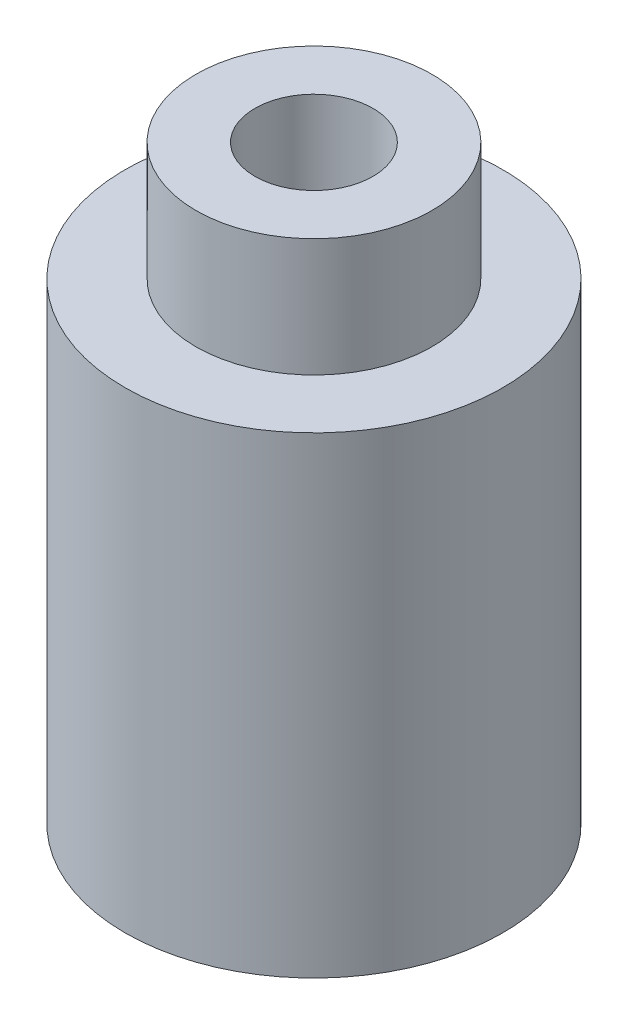
ISO-10303-21;
HEADER;
FILE_DESCRIPTION(('STEP AP214'),'2;1');
FILE_NAME('part.step','',(''),(''),'','','');
FILE_SCHEMA(('AUTOMOTIVE_DESIGN { 1 0 10303 214 1 1 1 1 }'));
ENDSEC;
DATA;
#1=APPLICATION_CONTEXT('core data for automotive mechanical design processes');
#2=APPLICATION_PROTOCOL_DEFINITION('international standard','automotive_design',2000,#1);
#3=PRODUCT_CONTEXT('',#1,'mechanical');
#4=PRODUCT('Part','Part','',(#3));
#5=PRODUCT_RELATED_PRODUCT_CATEGORY('part','',(#4));
#6=PRODUCT_DEFINITION_FORMATION('','',#4);
#7=PRODUCT_DEFINITION_CONTEXT('part definition',#1,'design');
#8=PRODUCT_DEFINITION('design','',#6,#7);
#9=PRODUCT_DEFINITION_SHAPE('','',#8);
#10=(LENGTH_UNIT() NAMED_UNIT(*) SI_UNIT(.MILLI.,.METRE.));
#11=(NAMED_UNIT(*) PLANE_ANGLE_UNIT() SI_UNIT($,.RADIAN.));
#12=(NAMED_UNIT(*) SI_UNIT($,.STERADIAN.) SOLID_ANGLE_UNIT());
#13=UNCERTAINTY_MEASURE_WITH_UNIT(LENGTH_MEASURE(1.E-05),#10,'distance_accuracy_value','');
#14=(GEOMETRIC_REPRESENTATION_CONTEXT(3) GLOBAL_UNCERTAINTY_ASSIGNED_CONTEXT((#13)) GLOBAL_UNIT_ASSIGNED_CONTEXT((#10,
#11,#12)) REPRESENTATION_CONTEXT('',''));
#15=CARTESIAN_POINT('',(0.,0.,0.));
#16=DIRECTION('',(0.,0.,1.));
#17=DIRECTION('',(1.,0.,0.));
#18=AXIS2_PLACEMENT_3D('',#15,#16,#17);
#19=CARTESIAN_POINT('',(0.,1523.42522136152,0.));
#20=DIRECTION('',(0.,-1.,0.));
#21=DIRECTION('',(0.,0.,-1.));
#22=AXIS2_PLACEMENT_3D('',#19,#20,#21);
#23=PLANE('',#22);
#24=CARTESIAN_POINT('',(0.,1523.42522136152,-1685.44800713512));
#25=DIRECTION('',(0.,1.,0.));
#26=DIRECTION('',(0.,0.,1.));
#27=AXIS2_PLACEMENT_3D('',#24,#25,#26);
#28=CIRCLE('',#27,4.99999999999989);
#29=CARTESIAN_POINT('',(0.,1523.42522136152,-1680.44800713512));
#30=VERTEX_POINT('',#29);
#31=EDGE_CURVE('E60',#30,#30,#28,.T.);
#32=ORIENTED_EDGE('',*,*,#31,.T.);
#33=EDGE_LOOP('',(#32));
#34=FACE_BOUND('',#33,.T.);
#35=CARTESIAN_POINT('',(0.,1523.42522136152,-1685.44800713512));
#36=DIRECTION('',(0.,1.,0.));
#37=DIRECTION('',(0.,0.,1.));
#38=AXIS2_PLACEMENT_3D('',#35,#36,#37);
#39=CIRCLE('',#38,8.00000000000001);
#40=CARTESIAN_POINT('',(0.,1523.42522136152,-1677.44800713512));
#41=VERTEX_POINT('',#40);
#42=EDGE_CURVE('E10',#41,#41,#39,.T.);
#43=ORIENTED_EDGE('',*,*,#42,.F.);
#44=EDGE_LOOP('',(#43));
#45=FACE_BOUND('',#44,.T.);
#46=ADVANCED_FACE('F32',(#34,#45),#23,.T.);
#47=CARTESIAN_POINT('',(0.,1543.42522136152,-1685.44800713512));
#48=DIRECTION('',(0.,1.,0.));
#49=DIRECTION('',(0.,0.,1.));
#50=AXIS2_PLACEMENT_3D('',#47,#48,#49);
#51=CYLINDRICAL_SURFACE('',#50,8.00000000000001);
#52=ORIENTED_EDGE('',*,*,#42,.T.);
#53=EDGE_LOOP('',(#52));
#54=FACE_BOUND('',#53,.T.);
#55=CARTESIAN_POINT('',(0.,1543.42522136152,-1685.44800713512));
#56=DIRECTION('',(0.,1.,0.));
#57=DIRECTION('',(0.,0.,1.));
#58=AXIS2_PLACEMENT_3D('',#55,#56,#57);
#59=CIRCLE('',#58,8.00000000000001);
#60=CARTESIAN_POINT('',(0.,1543.42522136152,-1677.44800713512));
#61=VERTEX_POINT('',#60);
#62=EDGE_CURVE('E38',#61,#61,#59,.T.);
#63=ORIENTED_EDGE('',*,*,#62,.F.);
#64=EDGE_LOOP('',(#63));
#65=FACE_BOUND('',#64,.T.);
#66=ADVANCED_FACE('F84',(#54,#65),#51,.T.);
#67=CARTESIAN_POINT('',(0.,1543.42522136152,-1.14236414502854E-10));
#68=DIRECTION('',(0.,-1.,0.));
#69=DIRECTION('',(0.,0.,-1.));
#70=AXIS2_PLACEMENT_3D('',#67,#68,#69);
#71=PLANE('',#70);
#72=CARTESIAN_POINT('',(0.,1543.42522136152,-1685.44800713512));
#73=DIRECTION('',(0.,1.,0.));
#74=DIRECTION('',(0.,0.,1.));
#75=AXIS2_PLACEMENT_3D('',#72,#73,#74);
#76=CIRCLE('',#75,4.99999999999989);
#77=CARTESIAN_POINT('',(0.,1543.42522136152,-1680.44800713512));
#78=VERTEX_POINT('',#77);
#79=EDGE_CURVE('E42',#78,#78,#76,.T.);
#80=ORIENTED_EDGE('',*,*,#79,.F.);
#81=EDGE_LOOP('',(#80));
#82=FACE_BOUND('',#81,.T.);
#83=ORIENTED_EDGE('',*,*,#62,.T.);
#84=EDGE_LOOP('',(#83));
#85=FACE_BOUND('',#84,.T.);
#86=ADVANCED_FACE('F88',(#82,#85),#71,.F.);
#87=CARTESIAN_POINT('',(0.,1543.42522136152,-1685.44800713512));
#88=DIRECTION('',(0.,1.,0.));
#89=DIRECTION('',(0.,0.,1.));
#90=AXIS2_PLACEMENT_3D('',#87,#88,#89);
#91=CYLINDRICAL_SURFACE('',#90,4.99999999999989);
#92=ORIENTED_EDGE('',*,*,#79,.T.);
#93=EDGE_LOOP('',(#92));
#94=FACE_BOUND('',#93,.T.);
#95=CARTESIAN_POINT('',(0.,1548.42522136152,-1685.44800713512));
#96=DIRECTION('',(0.,1.,0.));
#97=DIRECTION('',(0.,0.,1.));
#98=AXIS2_PLACEMENT_3D('',#95,#96,#97);
#99=CIRCLE('',#98,4.99999999999989);
#100=CARTESIAN_POINT('',(0.,1548.42522136152,-1680.44800713512));
#101=VERTEX_POINT('',#100);
#102=EDGE_CURVE('E46',#101,#101,#99,.T.);
#103=ORIENTED_EDGE('',*,*,#102,.F.);
#104=EDGE_LOOP('',(#103));
#105=FACE_BOUND('',#104,.T.);
#106=ADVANCED_FACE('F92',(#94,#105),#91,.T.);
#107=CARTESIAN_POINT('',(0.,1548.42522136152,0.));
#108=DIRECTION('',(0.,-1.,0.));
#109=DIRECTION('',(0.,0.,-1.));
#110=AXIS2_PLACEMENT_3D('',#107,#108,#109);
#111=PLANE('',#110);
#112=CARTESIAN_POINT('',(0.,1548.42522136152,-1685.44800713512));
#113=DIRECTION('',(0.,1.,0.));
#114=DIRECTION('',(0.,0.,1.));
#115=AXIS2_PLACEMENT_3D('',#112,#113,#114);
#116=CIRCLE('',#115,2.50000000000017);
#117=CARTESIAN_POINT('',(0.,1548.42522136152,-1682.94800713512));
#118=VERTEX_POINT('',#117);
#119=EDGE_CURVE('E51',#118,#118,#116,.T.);
#120=ORIENTED_EDGE('',*,*,#119,.F.);
#121=EDGE_LOOP('',(#120));
#122=FACE_BOUND('',#121,.T.);
#123=ORIENTED_EDGE('',*,*,#102,.T.);
#124=EDGE_LOOP('',(#123));
#125=FACE_BOUND('',#124,.T.);
#126=ADVANCED_FACE('F80',(#122,#125),#111,.F.);
#127=CARTESIAN_POINT('',(0.,1543.42522136152,-1685.44800713512));
#128=DIRECTION('',(0.,1.,0.));
#129=DIRECTION('',(0.,0.,1.));
#130=AXIS2_PLACEMENT_3D('',#127,#128,#129);
#131=CYLINDRICAL_SURFACE('',#130,2.50000000000017);
#132=CARTESIAN_POINT('',(0.,1542.06252511603,-1685.44800713512));
#133=DIRECTION('',(0.,1.,0.));
#134=DIRECTION('',(0.,0.,1.));
#135=AXIS2_PLACEMENT_3D('',#132,#133,#134);
#136=CIRCLE('',#135,2.50000000000017);
#137=CARTESIAN_POINT('',(0.,1542.06252511603,-1682.94800713512));
#138=VERTEX_POINT('',#137);
#139=EDGE_CURVE('E54',#138,#138,#136,.T.);
#140=ORIENTED_EDGE('',*,*,#139,.F.);
#141=EDGE_LOOP('',(#140));
#142=FACE_BOUND('',#141,.T.);
#143=ORIENTED_EDGE('',*,*,#119,.T.);
#144=EDGE_LOOP('',(#143));
#145=FACE_BOUND('',#144,.T.);
#146=ADVANCED_FACE('F74',(#142,#145),#131,.F.);
#147=CARTESIAN_POINT('',(0.,1542.06252511603,0.));
#148=DIRECTION('',(0.,-1.,0.));
#149=DIRECTION('',(0.,0.,-1.));
#150=AXIS2_PLACEMENT_3D('',#147,#148,#149);
#151=PLANE('',#150);
#152=ORIENTED_EDGE('',*,*,#139,.T.);
#153=EDGE_LOOP('',(#152));
#154=FACE_BOUND('',#153,.T.);
#155=CARTESIAN_POINT('',(0.,1542.06252511603,-1685.44800713512));
#156=DIRECTION('',(0.,1.,0.));
#157=DIRECTION('',(0.,0.,1.));
#158=AXIS2_PLACEMENT_3D('',#155,#156,#157);
#159=CIRCLE('',#158,4.99999999999989);
#160=CARTESIAN_POINT('',(0.,1542.06252511603,-1680.44800713512));
#161=VERTEX_POINT('',#160);
#162=EDGE_CURVE('E57',#161,#161,#159,.T.);
#163=ORIENTED_EDGE('',*,*,#162,.F.);
#164=EDGE_LOOP('',(#163));
#165=FACE_BOUND('',#164,.T.);
#166=ADVANCED_FACE('F69',(#154,#165),#151,.T.);
#167=CARTESIAN_POINT('',(0.,1543.42522136152,-1685.44800713512));
#168=DIRECTION('',(0.,1.,0.));
#169=DIRECTION('',(0.,0.,1.));
#170=AXIS2_PLACEMENT_3D('',#167,#168,#169);
#171=CYLINDRICAL_SURFACE('',#170,4.99999999999989);
#172=ORIENTED_EDGE('',*,*,#31,.F.);
#173=EDGE_LOOP('',(#172));
#174=FACE_BOUND('',#173,.T.);
#175=ORIENTED_EDGE('',*,*,#162,.T.);
#176=EDGE_LOOP('',(#175));
#177=FACE_BOUND('',#176,.T.);
#178=ADVANCED_FACE('F66',(#174,#177),#171,.F.);
#179=CLOSED_SHELL('',(#46,#66,#86,#106,#126,#146,#166,#178));
#180=MANIFOLD_SOLID_BREP('B2',#179);
#181=ADVANCED_BREP_SHAPE_REPRESENTATION('',(#18,#180),#14);
#182=SHAPE_DEFINITION_REPRESENTATION(#9,#181);
ENDSEC;
END-ISO-10303-21;
